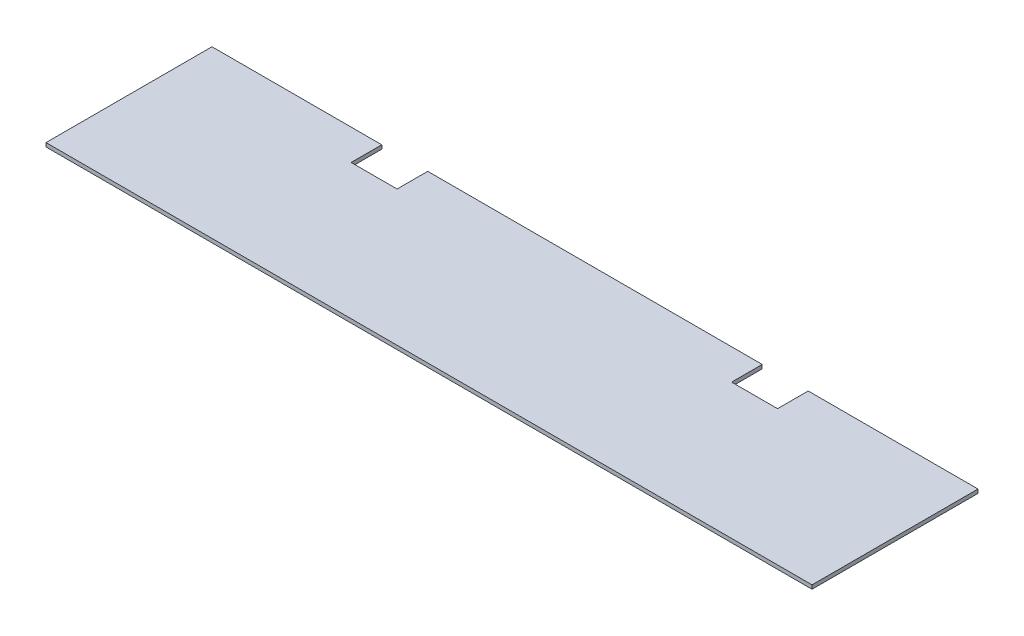
ISO-10303-21;
HEADER;
FILE_DESCRIPTION(('STEP AP214'),'2;1');
FILE_NAME('part.step','',(''),(''),'','','');
FILE_SCHEMA(('AUTOMOTIVE_DESIGN { 1 0 10303 214 1 1 1 1 }'));
ENDSEC;
DATA;
#1=APPLICATION_CONTEXT('core data for automotive mechanical design processes');
#2=APPLICATION_PROTOCOL_DEFINITION('international standard','automotive_design',2000,#1);
#3=PRODUCT_CONTEXT('',#1,'mechanical');
#4=PRODUCT('Part','Part','',(#3));
#5=PRODUCT_RELATED_PRODUCT_CATEGORY('part','',(#4));
#6=PRODUCT_DEFINITION_FORMATION('','',#4);
#7=PRODUCT_DEFINITION_CONTEXT('part definition',#1,'design');
#8=PRODUCT_DEFINITION('design','',#6,#7);
#9=PRODUCT_DEFINITION_SHAPE('','',#8);
#10=(LENGTH_UNIT() NAMED_UNIT(*) SI_UNIT(.MILLI.,.METRE.));
#11=(NAMED_UNIT(*) PLANE_ANGLE_UNIT() SI_UNIT($,.RADIAN.));
#12=(NAMED_UNIT(*) SI_UNIT($,.STERADIAN.) SOLID_ANGLE_UNIT());
#13=UNCERTAINTY_MEASURE_WITH_UNIT(LENGTH_MEASURE(1.E-05),#10,'distance_accuracy_value','');
#14=(GEOMETRIC_REPRESENTATION_CONTEXT(3) GLOBAL_UNCERTAINTY_ASSIGNED_CONTEXT((#13)) GLOBAL_UNIT_ASSIGNED_CONTEXT((#10,
#11,#12)) REPRESENTATION_CONTEXT('',''));
#15=CARTESIAN_POINT('',(0.,0.,0.));
#16=DIRECTION('',(0.,0.,1.));
#17=DIRECTION('',(1.,0.,0.));
#18=AXIS2_PLACEMENT_3D('',#15,#16,#17);
#19=CARTESIAN_POINT('',(0.,1.5,0.));
#20=DIRECTION('',(1.,0.,0.));
#21=DIRECTION('',(0.,0.,-1.));
#22=AXIS2_PLACEMENT_3D('',#19,#20,#21);
#23=PLANE('',#22);
#24=DIRECTION('',(0.,0.,1.));
#25=VECTOR('',#24,1.);
#26=CARTESIAN_POINT('',(0.,0.,0.));
#27=LINE('',#26,#25);
#28=CARTESIAN_POINT('',(0.,0.,-65.));
#29=VERTEX_POINT('',#28);
#30=CARTESIAN_POINT('',(0.,0.,0.));
#31=VERTEX_POINT('',#30);
#32=EDGE_CURVE('E154',#29,#31,#27,.T.);
#33=ORIENTED_EDGE('',*,*,#32,.T.);
#34=DIRECTION('',(0.,-1.,0.));
#35=VECTOR('',#34,1.);
#36=CARTESIAN_POINT('',(0.,1.5,0.));
#37=LINE('',#36,#35);
#38=CARTESIAN_POINT('',(0.,1.5,0.));
#39=VERTEX_POINT('',#38);
#40=EDGE_CURVE('E11',#39,#31,#37,.T.);
#41=ORIENTED_EDGE('',*,*,#40,.F.);
#42=DIRECTION('',(0.,0.,1.));
#43=VECTOR('',#42,1.);
#44=CARTESIAN_POINT('',(0.,1.5,0.));
#45=LINE('',#44,#43);
#46=CARTESIAN_POINT('',(0.,1.5,-65.));
#47=VERTEX_POINT('',#46);
#48=EDGE_CURVE('E176',#47,#39,#45,.T.);
#49=ORIENTED_EDGE('',*,*,#48,.F.);
#50=DIRECTION('',(0.,-1.,0.));
#51=VECTOR('',#50,1.);
#52=CARTESIAN_POINT('',(0.,1.5,-65.));
#53=LINE('',#52,#51);
#54=EDGE_CURVE('E150',#47,#29,#53,.T.);
#55=ORIENTED_EDGE('',*,*,#54,.T.);
#56=EDGE_LOOP('',(#33,#41,#49,#55));
#57=FACE_BOUND('',#56,.T.);
#58=ADVANCED_FACE('F34',(#57),#23,.F.);
#59=CARTESIAN_POINT('',(0.,1.5,0.));
#60=DIRECTION('',(0.,0.,-1.));
#61=DIRECTION('',(-1.,0.,0.));
#62=AXIS2_PLACEMENT_3D('',#59,#60,#61);
#63=PLANE('',#62);
#64=DIRECTION('',(1.,0.,0.));
#65=VECTOR('',#64,1.);
#66=CARTESIAN_POINT('',(0.,0.,0.));
#67=LINE('',#66,#65);
#68=CARTESIAN_POINT('',(300.,0.,0.));
#69=VERTEX_POINT('',#68);
#70=EDGE_CURVE('E157',#31,#69,#67,.T.);
#71=ORIENTED_EDGE('',*,*,#70,.T.);
#72=DIRECTION('',(0.,-1.,0.));
#73=VECTOR('',#72,1.);
#74=CARTESIAN_POINT('',(300.,1.5,0.));
#75=LINE('',#74,#73);
#76=CARTESIAN_POINT('',(300.,1.5,0.));
#77=VERTEX_POINT('',#76);
#78=EDGE_CURVE('E42',#77,#69,#75,.T.);
#79=ORIENTED_EDGE('',*,*,#78,.F.);
#80=DIRECTION('',(1.,0.,0.));
#81=VECTOR('',#80,1.);
#82=CARTESIAN_POINT('',(0.,1.5,0.));
#83=LINE('',#82,#81);
#84=EDGE_CURVE('E105',#39,#77,#83,.T.);
#85=ORIENTED_EDGE('',*,*,#84,.F.);
#86=ORIENTED_EDGE('',*,*,#40,.T.);
#87=EDGE_LOOP('',(#71,#79,#85,#86));
#88=FACE_BOUND('',#87,.T.);
#89=ADVANCED_FACE('F254',(#88),#63,.F.);
#90=CARTESIAN_POINT('',(300.,1.5,0.));
#91=DIRECTION('',(-1.,0.,0.));
#92=DIRECTION('',(0.,0.,1.));
#93=AXIS2_PLACEMENT_3D('',#90,#91,#92);
#94=PLANE('',#93);
#95=DIRECTION('',(0.,0.,-1.));
#96=VECTOR('',#95,1.);
#97=CARTESIAN_POINT('',(300.,0.,0.));
#98=LINE('',#97,#96);
#99=CARTESIAN_POINT('',(300.,0.,-65.));
#100=VERTEX_POINT('',#99);
#101=EDGE_CURVE('E159',#69,#100,#98,.T.);
#102=ORIENTED_EDGE('',*,*,#101,.T.);
#103=DIRECTION('',(0.,-1.,0.));
#104=VECTOR('',#103,1.);
#105=CARTESIAN_POINT('',(300.,1.5,-65.));
#106=LINE('',#105,#104);
#107=CARTESIAN_POINT('',(300.,1.5,-65.));
#108=VERTEX_POINT('',#107);
#109=EDGE_CURVE('E195',#108,#100,#106,.T.);
#110=ORIENTED_EDGE('',*,*,#109,.F.);
#111=DIRECTION('',(0.,0.,-1.));
#112=VECTOR('',#111,1.);
#113=CARTESIAN_POINT('',(300.,1.5,0.));
#114=LINE('',#113,#112);
#115=EDGE_CURVE('E203',#77,#108,#114,.T.);
#116=ORIENTED_EDGE('',*,*,#115,.F.);
#117=ORIENTED_EDGE('',*,*,#78,.T.);
#118=EDGE_LOOP('',(#102,#110,#116,#117));
#119=FACE_BOUND('',#118,.T.);
#120=ADVANCED_FACE('F201',(#119),#94,.F.);
#121=CARTESIAN_POINT('',(233.5,1.5,-65.));
#122=DIRECTION('',(0.,0.,1.));
#123=DIRECTION('',(1.,0.,0.));
#124=AXIS2_PLACEMENT_3D('',#121,#122,#123);
#125=PLANE('',#124);
#126=DIRECTION('',(-1.,0.,0.));
#127=VECTOR('',#126,1.);
#128=CARTESIAN_POINT('',(233.5,0.,-65.));
#129=LINE('',#128,#127);
#130=CARTESIAN_POINT('',(233.5,0.,-65.));
#131=VERTEX_POINT('',#130);
#132=EDGE_CURVE('E161',#100,#131,#129,.T.);
#133=ORIENTED_EDGE('',*,*,#132,.T.);
#134=DIRECTION('',(0.,-1.,0.));
#135=VECTOR('',#134,1.);
#136=CARTESIAN_POINT('',(233.5,1.5,-65.));
#137=LINE('',#136,#135);
#138=CARTESIAN_POINT('',(233.5,1.5,-65.));
#139=VERTEX_POINT('',#138);
#140=EDGE_CURVE('E192',#139,#131,#137,.T.);
#141=ORIENTED_EDGE('',*,*,#140,.F.);
#142=DIRECTION('',(-1.,0.,0.));
#143=VECTOR('',#142,1.);
#144=CARTESIAN_POINT('',(233.5,1.5,-65.));
#145=LINE('',#144,#143);
#146=EDGE_CURVE('E221',#108,#139,#145,.T.);
#147=ORIENTED_EDGE('',*,*,#146,.F.);
#148=ORIENTED_EDGE('',*,*,#109,.T.);
#149=EDGE_LOOP('',(#133,#141,#147,#148));
#150=FACE_BOUND('',#149,.T.);
#151=ADVANCED_FACE('F212',(#150),#125,.F.);
#152=CARTESIAN_POINT('',(233.5,1.5,-53.));
#153=DIRECTION('',(1.,0.,0.));
#154=DIRECTION('',(0.,0.,-1.));
#155=AXIS2_PLACEMENT_3D('',#152,#153,#154);
#156=PLANE('',#155);
#157=DIRECTION('',(0.,0.,1.));
#158=VECTOR('',#157,1.);
#159=CARTESIAN_POINT('',(233.5,0.,-53.));
#160=LINE('',#159,#158);
#161=CARTESIAN_POINT('',(233.5,0.,-53.));
#162=VERTEX_POINT('',#161);
#163=EDGE_CURVE('E163',#131,#162,#160,.T.);
#164=ORIENTED_EDGE('',*,*,#163,.T.);
#165=DIRECTION('',(0.,-1.,0.));
#166=VECTOR('',#165,1.);
#167=CARTESIAN_POINT('',(233.5,1.5,-53.));
#168=LINE('',#167,#166);
#169=CARTESIAN_POINT('',(233.5,1.5,-53.));
#170=VERTEX_POINT('',#169);
#171=EDGE_CURVE('E189',#170,#162,#168,.T.);
#172=ORIENTED_EDGE('',*,*,#171,.F.);
#173=DIRECTION('',(0.,0.,1.));
#174=VECTOR('',#173,1.);
#175=CARTESIAN_POINT('',(233.5,1.5,-53.));
#176=LINE('',#175,#174);
#177=EDGE_CURVE('E218',#139,#170,#176,.T.);
#178=ORIENTED_EDGE('',*,*,#177,.F.);
#179=ORIENTED_EDGE('',*,*,#140,.T.);
#180=EDGE_LOOP('',(#164,#172,#178,#179));
#181=FACE_BOUND('',#180,.T.);
#182=ADVANCED_FACE('F216',(#181),#156,.F.);
#183=CARTESIAN_POINT('',(233.5,1.5,-53.));
#184=DIRECTION('',(0.,0.,1.));
#185=DIRECTION('',(1.,0.,0.));
#186=AXIS2_PLACEMENT_3D('',#183,#184,#185);
#187=PLANE('',#186);
#188=DIRECTION('',(-1.,0.,0.));
#189=VECTOR('',#188,1.);
#190=CARTESIAN_POINT('',(233.5,0.,-53.));
#191=LINE('',#190,#189);
#192=CARTESIAN_POINT('',(215.5,0.,-53.));
#193=VERTEX_POINT('',#192);
#194=EDGE_CURVE('E165',#162,#193,#191,.T.);
#195=ORIENTED_EDGE('',*,*,#194,.T.);
#196=DIRECTION('',(0.,-1.,0.));
#197=VECTOR('',#196,1.);
#198=CARTESIAN_POINT('',(215.5,1.5,-53.));
#199=LINE('',#198,#197);
#200=CARTESIAN_POINT('',(215.5,1.5,-53.));
#201=VERTEX_POINT('',#200);
#202=EDGE_CURVE('E186',#201,#193,#199,.T.);
#203=ORIENTED_EDGE('',*,*,#202,.F.);
#204=DIRECTION('',(-1.,0.,0.));
#205=VECTOR('',#204,1.);
#206=CARTESIAN_POINT('',(233.5,1.5,-53.));
#207=LINE('',#206,#205);
#208=EDGE_CURVE('E220',#170,#201,#207,.T.);
#209=ORIENTED_EDGE('',*,*,#208,.F.);
#210=ORIENTED_EDGE('',*,*,#171,.T.);
#211=EDGE_LOOP('',(#195,#203,#209,#210));
#212=FACE_BOUND('',#211,.T.);
#213=ADVANCED_FACE('F267',(#212),#187,.F.);
#214=CARTESIAN_POINT('',(215.5,1.5,-53.));
#215=DIRECTION('',(-1.,0.,0.));
#216=DIRECTION('',(0.,0.,1.));
#217=AXIS2_PLACEMENT_3D('',#214,#215,#216);
#218=PLANE('',#217);
#219=DIRECTION('',(0.,0.,-1.));
#220=VECTOR('',#219,1.);
#221=CARTESIAN_POINT('',(215.5,0.,-53.));
#222=LINE('',#221,#220);
#223=CARTESIAN_POINT('',(215.5,0.,-65.));
#224=VERTEX_POINT('',#223);
#225=EDGE_CURVE('E167',#193,#224,#222,.T.);
#226=ORIENTED_EDGE('',*,*,#225,.T.);
#227=DIRECTION('',(0.,-1.,0.));
#228=VECTOR('',#227,1.);
#229=CARTESIAN_POINT('',(215.5,1.5,-65.));
#230=LINE('',#229,#228);
#231=CARTESIAN_POINT('',(215.5,1.5,-65.));
#232=VERTEX_POINT('',#231);
#233=EDGE_CURVE('E183',#232,#224,#230,.T.);
#234=ORIENTED_EDGE('',*,*,#233,.F.);
#235=DIRECTION('',(0.,0.,-1.));
#236=VECTOR('',#235,1.);
#237=CARTESIAN_POINT('',(215.5,1.5,-53.));
#238=LINE('',#237,#236);
#239=EDGE_CURVE('E223',#201,#232,#238,.T.);
#240=ORIENTED_EDGE('',*,*,#239,.F.);
#241=ORIENTED_EDGE('',*,*,#202,.T.);
#242=EDGE_LOOP('',(#226,#234,#240,#241));
#243=FACE_BOUND('',#242,.T.);
#244=ADVANCED_FACE('F270',(#243),#218,.F.);
#245=CARTESIAN_POINT('',(84.5,1.5,-65.));
#246=DIRECTION('',(0.,0.,1.));
#247=DIRECTION('',(1.,0.,0.));
#248=AXIS2_PLACEMENT_3D('',#245,#246,#247);
#249=PLANE('',#248);
#250=DIRECTION('',(-1.,0.,0.));
#251=VECTOR('',#250,1.);
#252=CARTESIAN_POINT('',(84.5,0.,-65.));
#253=LINE('',#252,#251);
#254=CARTESIAN_POINT('',(84.5,0.,-65.));
#255=VERTEX_POINT('',#254);
#256=EDGE_CURVE('E169',#224,#255,#253,.T.);
#257=ORIENTED_EDGE('',*,*,#256,.T.);
#258=DIRECTION('',(0.,-1.,0.));
#259=VECTOR('',#258,1.);
#260=CARTESIAN_POINT('',(84.5,1.5,-65.));
#261=LINE('',#260,#259);
#262=CARTESIAN_POINT('',(84.5,1.5,-65.));
#263=VERTEX_POINT('',#262);
#264=EDGE_CURVE('E180',#263,#255,#261,.T.);
#265=ORIENTED_EDGE('',*,*,#264,.F.);
#266=DIRECTION('',(-1.,0.,0.));
#267=VECTOR('',#266,1.);
#268=CARTESIAN_POINT('',(84.5,1.5,-65.));
#269=LINE('',#268,#267);
#270=EDGE_CURVE('E229',#232,#263,#269,.T.);
#271=ORIENTED_EDGE('',*,*,#270,.F.);
#272=ORIENTED_EDGE('',*,*,#233,.T.);
#273=EDGE_LOOP('',(#257,#265,#271,#272));
#274=FACE_BOUND('',#273,.T.);
#275=ADVANCED_FACE('F235',(#274),#249,.F.);
#276=CARTESIAN_POINT('',(84.5,1.5,-53.));
#277=DIRECTION('',(1.,0.,0.));
#278=DIRECTION('',(0.,0.,-1.));
#279=AXIS2_PLACEMENT_3D('',#276,#277,#278);
#280=PLANE('',#279);
#281=DIRECTION('',(0.,0.,1.));
#282=VECTOR('',#281,1.);
#283=CARTESIAN_POINT('',(84.5,0.,-53.));
#284=LINE('',#283,#282);
#285=CARTESIAN_POINT('',(84.5,0.,-53.));
#286=VERTEX_POINT('',#285);
#287=EDGE_CURVE('E171',#255,#286,#284,.T.);
#288=ORIENTED_EDGE('',*,*,#287,.T.);
#289=DIRECTION('',(0.,-1.,0.));
#290=VECTOR('',#289,1.);
#291=CARTESIAN_POINT('',(84.5,1.5,-53.));
#292=LINE('',#291,#290);
#293=CARTESIAN_POINT('',(84.5,1.5,-53.));
#294=VERTEX_POINT('',#293);
#295=EDGE_CURVE('E145',#294,#286,#292,.T.);
#296=ORIENTED_EDGE('',*,*,#295,.F.);
#297=DIRECTION('',(0.,0.,1.));
#298=VECTOR('',#297,1.);
#299=CARTESIAN_POINT('',(84.5,1.5,-53.));
#300=LINE('',#299,#298);
#301=EDGE_CURVE('E136',#263,#294,#300,.T.);
#302=ORIENTED_EDGE('',*,*,#301,.F.);
#303=ORIENTED_EDGE('',*,*,#264,.T.);
#304=EDGE_LOOP('',(#288,#296,#302,#303));
#305=FACE_BOUND('',#304,.T.);
#306=ADVANCED_FACE('F239',(#305),#280,.F.);
#307=CARTESIAN_POINT('',(66.5,1.5,-53.));
#308=DIRECTION('',(0.,0.,1.));
#309=DIRECTION('',(1.,0.,0.));
#310=AXIS2_PLACEMENT_3D('',#307,#308,#309);
#311=PLANE('',#310);
#312=DIRECTION('',(-1.,0.,0.));
#313=VECTOR('',#312,1.);
#314=CARTESIAN_POINT('',(66.5,0.,-53.));
#315=LINE('',#314,#313);
#316=CARTESIAN_POINT('',(66.5,0.,-53.));
#317=VERTEX_POINT('',#316);
#318=EDGE_CURVE('E144',#286,#317,#315,.T.);
#319=ORIENTED_EDGE('',*,*,#318,.T.);
#320=DIRECTION('',(0.,-1.,0.));
#321=VECTOR('',#320,1.);
#322=CARTESIAN_POINT('',(66.5,1.5,-53.));
#323=LINE('',#322,#321);
#324=CARTESIAN_POINT('',(66.5,1.5,-53.));
#325=VERTEX_POINT('',#324);
#326=EDGE_CURVE('E141',#325,#317,#323,.T.);
#327=ORIENTED_EDGE('',*,*,#326,.F.);
#328=DIRECTION('',(-1.,0.,0.));
#329=VECTOR('',#328,1.);
#330=CARTESIAN_POINT('',(66.5,1.5,-53.));
#331=LINE('',#330,#329);
#332=EDGE_CURVE('E130',#294,#325,#331,.T.);
#333=ORIENTED_EDGE('',*,*,#332,.F.);
#334=ORIENTED_EDGE('',*,*,#295,.T.);
#335=EDGE_LOOP('',(#319,#327,#333,#334));
#336=FACE_BOUND('',#335,.T.);
#337=ADVANCED_FACE('F142',(#336),#311,.F.);
#338=CARTESIAN_POINT('',(66.5,1.5,-53.));
#339=DIRECTION('',(-1.,0.,0.));
#340=DIRECTION('',(0.,0.,1.));
#341=AXIS2_PLACEMENT_3D('',#338,#339,#340);
#342=PLANE('',#341);
#343=DIRECTION('',(0.,0.,-1.));
#344=VECTOR('',#343,1.);
#345=CARTESIAN_POINT('',(66.5,0.,-53.));
#346=LINE('',#345,#344);
#347=CARTESIAN_POINT('',(66.5,0.,-65.));
#348=VERTEX_POINT('',#347);
#349=EDGE_CURVE('E91',#317,#348,#346,.T.);
#350=ORIENTED_EDGE('',*,*,#349,.T.);
#351=DIRECTION('',(0.,-1.,0.));
#352=VECTOR('',#351,1.);
#353=CARTESIAN_POINT('',(66.5,1.5,-65.));
#354=LINE('',#353,#352);
#355=CARTESIAN_POINT('',(66.5,1.5,-65.));
#356=VERTEX_POINT('',#355);
#357=EDGE_CURVE('E146',#356,#348,#354,.T.);
#358=ORIENTED_EDGE('',*,*,#357,.F.);
#359=DIRECTION('',(0.,0.,-1.));
#360=VECTOR('',#359,1.);
#361=CARTESIAN_POINT('',(66.5,1.5,-53.));
#362=LINE('',#361,#360);
#363=EDGE_CURVE('E134',#325,#356,#362,.T.);
#364=ORIENTED_EDGE('',*,*,#363,.F.);
#365=ORIENTED_EDGE('',*,*,#326,.T.);
#366=EDGE_LOOP('',(#350,#358,#364,#365));
#367=FACE_BOUND('',#366,.T.);
#368=ADVANCED_FACE('F148',(#367),#342,.F.);
#369=CARTESIAN_POINT('',(0.,1.5,-65.));
#370=DIRECTION('',(0.,0.,1.));
#371=DIRECTION('',(1.,0.,0.));
#372=AXIS2_PLACEMENT_3D('',#369,#370,#371);
#373=PLANE('',#372);
#374=DIRECTION('',(-1.,0.,0.));
#375=VECTOR('',#374,1.);
#376=CARTESIAN_POINT('',(0.,0.,-65.));
#377=LINE('',#376,#375);
#378=EDGE_CURVE('E97',#348,#29,#377,.T.);
#379=ORIENTED_EDGE('',*,*,#378,.T.);
#380=ORIENTED_EDGE('',*,*,#54,.F.);
#381=DIRECTION('',(-1.,0.,0.));
#382=VECTOR('',#381,1.);
#383=CARTESIAN_POINT('',(0.,1.5,-65.));
#384=LINE('',#383,#382);
#385=EDGE_CURVE('E50',#356,#47,#384,.T.);
#386=ORIENTED_EDGE('',*,*,#385,.F.);
#387=ORIENTED_EDGE('',*,*,#357,.T.);
#388=EDGE_LOOP('',(#379,#380,#386,#387));
#389=FACE_BOUND('',#388,.T.);
#390=ADVANCED_FACE('F243',(#389),#373,.F.);
#391=CARTESIAN_POINT('',(0.,1.5,0.));
#392=DIRECTION('',(0.,-1.,0.));
#393=DIRECTION('',(0.,0.,-1.));
#394=AXIS2_PLACEMENT_3D('',#391,#392,#393);
#395=PLANE('',#394);
#396=ORIENTED_EDGE('',*,*,#48,.T.);
#397=ORIENTED_EDGE('',*,*,#84,.T.);
#398=ORIENTED_EDGE('',*,*,#115,.T.);
#399=ORIENTED_EDGE('',*,*,#146,.T.);
#400=ORIENTED_EDGE('',*,*,#177,.T.);
#401=ORIENTED_EDGE('',*,*,#208,.T.);
#402=ORIENTED_EDGE('',*,*,#239,.T.);
#403=ORIENTED_EDGE('',*,*,#270,.T.);
#404=ORIENTED_EDGE('',*,*,#301,.T.);
#405=ORIENTED_EDGE('',*,*,#332,.T.);
#406=ORIENTED_EDGE('',*,*,#363,.T.);
#407=ORIENTED_EDGE('',*,*,#385,.T.);
#408=EDGE_LOOP('',(#396,#397,#398,#399,#400,#401,#402,#403,#404,#405,#406,#407));
#409=FACE_BOUND('',#408,.T.);
#410=ADVANCED_FACE('F132',(#409),#395,.F.);
#411=CARTESIAN_POINT('',(0.,0.,0.));
#412=DIRECTION('',(0.,-1.,0.));
#413=DIRECTION('',(0.,0.,-1.));
#414=AXIS2_PLACEMENT_3D('',#411,#412,#413);
#415=PLANE('',#414);
#416=ORIENTED_EDGE('',*,*,#32,.F.);
#417=ORIENTED_EDGE('',*,*,#378,.F.);
#418=ORIENTED_EDGE('',*,*,#349,.F.);
#419=ORIENTED_EDGE('',*,*,#318,.F.);
#420=ORIENTED_EDGE('',*,*,#287,.F.);
#421=ORIENTED_EDGE('',*,*,#256,.F.);
#422=ORIENTED_EDGE('',*,*,#225,.F.);
#423=ORIENTED_EDGE('',*,*,#194,.F.);
#424=ORIENTED_EDGE('',*,*,#163,.F.);
#425=ORIENTED_EDGE('',*,*,#132,.F.);
#426=ORIENTED_EDGE('',*,*,#101,.F.);
#427=ORIENTED_EDGE('',*,*,#70,.F.);
#428=EDGE_LOOP('',(#416,#417,#418,#419,#420,#421,#422,#423,#424,#425,#426,#427));
#429=FACE_BOUND('',#428,.T.);
#430=ADVANCED_FACE('F207',(#429),#415,.T.);
#431=CLOSED_SHELL('',(#58,#89,#120,#151,#182,#213,#244,#275,#306,#337,#368,#390,#410,#430));
#432=MANIFOLD_SOLID_BREP('B2',#431);
#433=ADVANCED_BREP_SHAPE_REPRESENTATION('',(#18,#432),#14);
#434=SHAPE_DEFINITION_REPRESENTATION(#9,#433);
ENDSEC;
END-ISO-10303-21;
